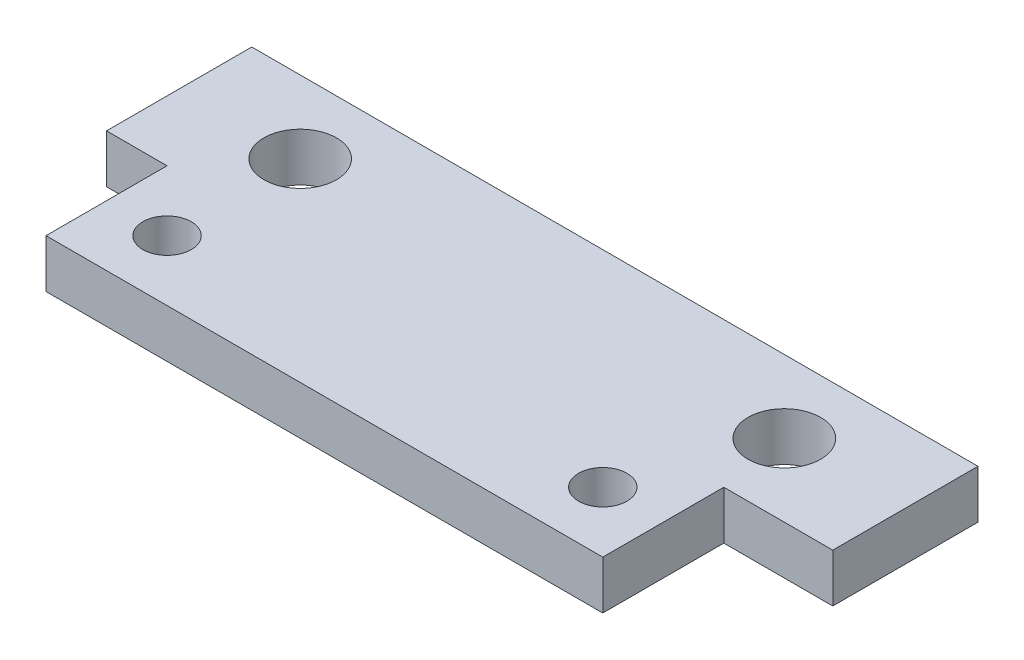
ISO-10303-21;
HEADER;
FILE_DESCRIPTION(('STEP AP214'),'2;1');
FILE_NAME('part.step','',(''),(''),'','','');
FILE_SCHEMA(('AUTOMOTIVE_DESIGN { 1 0 10303 214 1 1 1 1 }'));
ENDSEC;
DATA;
#1=APPLICATION_CONTEXT('core data for automotive mechanical design processes');
#2=APPLICATION_PROTOCOL_DEFINITION('international standard','automotive_design',2000,#1);
#3=PRODUCT_CONTEXT('',#1,'mechanical');
#4=PRODUCT('Part','Part','',(#3));
#5=PRODUCT_RELATED_PRODUCT_CATEGORY('part','',(#4));
#6=PRODUCT_DEFINITION_FORMATION('','',#4);
#7=PRODUCT_DEFINITION_CONTEXT('part definition',#1,'design');
#8=PRODUCT_DEFINITION('design','',#6,#7);
#9=PRODUCT_DEFINITION_SHAPE('','',#8);
#10=(LENGTH_UNIT() NAMED_UNIT(*) SI_UNIT(.MILLI.,.METRE.));
#11=(NAMED_UNIT(*) PLANE_ANGLE_UNIT() SI_UNIT($,.RADIAN.));
#12=(NAMED_UNIT(*) SI_UNIT($,.STERADIAN.) SOLID_ANGLE_UNIT());
#13=UNCERTAINTY_MEASURE_WITH_UNIT(LENGTH_MEASURE(1.E-05),#10,'distance_accuracy_value','');
#14=(GEOMETRIC_REPRESENTATION_CONTEXT(3) GLOBAL_UNCERTAINTY_ASSIGNED_CONTEXT((#13)) GLOBAL_UNIT_ASSIGNED_CONTEXT((#10,
#11,#12)) REPRESENTATION_CONTEXT('',''));
#15=CARTESIAN_POINT('',(0.,0.,0.));
#16=DIRECTION('',(0.,0.,1.));
#17=DIRECTION('',(1.,0.,0.));
#18=AXIS2_PLACEMENT_3D('',#15,#16,#17);
#19=CARTESIAN_POINT('',(0.,2.,0.));
#20=DIRECTION('',(0.,0.,-1.));
#21=DIRECTION('',(-1.,0.,0.));
#22=AXIS2_PLACEMENT_3D('',#19,#20,#21);
#23=PLANE('',#22);
#24=DIRECTION('',(0.,1.,0.));
#25=VECTOR('',#24,1.);
#26=CARTESIAN_POINT('',(25.5,-23.5372045918797,0.));
#27=LINE('',#26,#25);
#28=CARTESIAN_POINT('',(25.5,0.,0.));
#29=VERTEX_POINT('',#28);
#30=CARTESIAN_POINT('',(25.5,2.,0.));
#31=VERTEX_POINT('',#30);
#32=EDGE_CURVE('E122',#29,#31,#27,.T.);
#33=ORIENTED_EDGE('',*,*,#32,.F.);
#34=DIRECTION('',(1.,0.,0.));
#35=VECTOR('',#34,1.);
#36=CARTESIAN_POINT('',(0.,0.,0.));
#37=LINE('',#36,#35);
#38=CARTESIAN_POINT('',(30.,0.,0.));
#39=VERTEX_POINT('',#38);
#40=EDGE_CURVE('E167',#29,#39,#37,.T.);
#41=ORIENTED_EDGE('',*,*,#40,.T.);
#42=DIRECTION('',(0.,-1.,0.));
#43=VECTOR('',#42,1.);
#44=CARTESIAN_POINT('',(30.,2.,0.));
#45=LINE('',#44,#43);
#46=CARTESIAN_POINT('',(30.,2.,0.));
#47=VERTEX_POINT('',#46);
#48=EDGE_CURVE('E44',#47,#39,#45,.T.);
#49=ORIENTED_EDGE('',*,*,#48,.F.);
#50=DIRECTION('',(1.,0.,0.));
#51=VECTOR('',#50,1.);
#52=CARTESIAN_POINT('',(0.,2.,0.));
#53=LINE('',#52,#51);
#54=EDGE_CURVE('E159',#31,#47,#53,.T.);
#55=ORIENTED_EDGE('',*,*,#54,.F.);
#56=EDGE_LOOP('',(#33,#41,#49,#55));
#57=FACE_BOUND('',#56,.T.);
#58=ADVANCED_FACE('F36',(#57),#23,.F.);
#59=CARTESIAN_POINT('',(0.,2.,0.));
#60=DIRECTION('',(0.,-1.,0.));
#61=DIRECTION('',(0.,0.,-1.));
#62=AXIS2_PLACEMENT_3D('',#59,#60,#61);
#63=PLANE('',#62);
#64=DIRECTION('',(0.,0.,1.));
#65=VECTOR('',#64,1.);
#66=CARTESIAN_POINT('',(0.,2.,0.));
#67=LINE('',#66,#65);
#68=CARTESIAN_POINT('',(0.,2.,-6.));
#69=VERTEX_POINT('',#68);
#70=CARTESIAN_POINT('',(0.,2.,0.));
#71=VERTEX_POINT('',#70);
#72=EDGE_CURVE('E157',#69,#71,#67,.T.);
#73=ORIENTED_EDGE('',*,*,#72,.T.);
#74=CARTESIAN_POINT('',(2.5,2.,0.));
#75=VERTEX_POINT('',#74);
#76=EDGE_CURVE('E87',#71,#75,#53,.T.);
#77=ORIENTED_EDGE('',*,*,#76,.T.);
#78=DIRECTION('',(0.,0.,1.));
#79=VECTOR('',#78,1.);
#80=CARTESIAN_POINT('',(2.5,2.,0.));
#81=LINE('',#80,#79);
#82=CARTESIAN_POINT('',(2.5,2.,5.));
#83=VERTEX_POINT('',#82);
#84=EDGE_CURVE('E51',#75,#83,#81,.T.);
#85=ORIENTED_EDGE('',*,*,#84,.T.);
#86=DIRECTION('',(1.,0.,0.));
#87=VECTOR('',#86,1.);
#88=CARTESIAN_POINT('',(2.5,2.,5.));
#89=LINE('',#88,#87);
#90=CARTESIAN_POINT('',(25.5,2.,5.));
#91=VERTEX_POINT('',#90);
#92=EDGE_CURVE('E128',#83,#91,#89,.T.);
#93=ORIENTED_EDGE('',*,*,#92,.T.);
#94=DIRECTION('',(0.,0.,-1.));
#95=VECTOR('',#94,1.);
#96=CARTESIAN_POINT('',(25.5,2.,5.));
#97=LINE('',#96,#95);
#98=EDGE_CURVE('E217',#91,#31,#97,.T.);
#99=ORIENTED_EDGE('',*,*,#98,.T.);
#100=ORIENTED_EDGE('',*,*,#54,.T.);
#101=DIRECTION('',(0.,0.,-1.));
#102=VECTOR('',#101,1.);
#103=CARTESIAN_POINT('',(30.,2.,0.));
#104=LINE('',#103,#102);
#105=CARTESIAN_POINT('',(30.,2.,-6.));
#106=VERTEX_POINT('',#105);
#107=EDGE_CURVE('E161',#47,#106,#104,.T.);
#108=ORIENTED_EDGE('',*,*,#107,.T.);
#109=DIRECTION('',(-1.,0.,0.));
#110=VECTOR('',#109,1.);
#111=CARTESIAN_POINT('',(0.,2.,-6.));
#112=LINE('',#111,#110);
#113=EDGE_CURVE('E60',#106,#69,#112,.T.);
#114=ORIENTED_EDGE('',*,*,#113,.T.);
#115=EDGE_LOOP('',(#73,#77,#85,#93,#99,#100,#108,#114));
#116=FACE_BOUND('',#115,.T.);
#117=CARTESIAN_POINT('',(5.,2.,-3.));
#118=DIRECTION('',(0.,1.,0.));
#119=DIRECTION('',(0.,0.,1.));
#120=AXIS2_PLACEMENT_3D('',#117,#118,#119);
#121=CIRCLE('',#120,1.5);
#122=CARTESIAN_POINT('',(5.,2.,-1.5));
#123=VERTEX_POINT('',#122);
#124=EDGE_CURVE('E151',#123,#123,#121,.T.);
#125=ORIENTED_EDGE('',*,*,#124,.F.);
#126=EDGE_LOOP('',(#125));
#127=FACE_BOUND('',#126,.T.);
#128=CARTESIAN_POINT('',(25.,2.,-3.));
#129=DIRECTION('',(0.,1.,0.));
#130=DIRECTION('',(0.,0.,1.));
#131=AXIS2_PLACEMENT_3D('',#128,#129,#130);
#132=CIRCLE('',#131,1.5);
#133=CARTESIAN_POINT('',(25.,2.,-1.5));
#134=VERTEX_POINT('',#133);
#135=EDGE_CURVE('E143',#134,#134,#132,.T.);
#136=ORIENTED_EDGE('',*,*,#135,.F.);
#137=EDGE_LOOP('',(#136));
#138=FACE_BOUND('',#137,.T.);
#139=CARTESIAN_POINT('',(5.,2.,2.5));
#140=DIRECTION('',(0.,1.,0.));
#141=DIRECTION('',(0.,0.,1.));
#142=AXIS2_PLACEMENT_3D('',#139,#140,#141);
#143=CIRCLE('',#142,1.);
#144=CARTESIAN_POINT('',(5.,2.,3.5));
#145=VERTEX_POINT('',#144);
#146=EDGE_CURVE('E215',#145,#145,#143,.T.);
#147=ORIENTED_EDGE('',*,*,#146,.F.);
#148=EDGE_LOOP('',(#147));
#149=FACE_BOUND('',#148,.T.);
#150=CARTESIAN_POINT('',(23.,2.,2.5));
#151=DIRECTION('',(0.,1.,0.));
#152=DIRECTION('',(0.,0.,1.));
#153=AXIS2_PLACEMENT_3D('',#150,#151,#152);
#154=CIRCLE('',#153,0.999999999999998);
#155=CARTESIAN_POINT('',(23.,2.,3.5));
#156=VERTEX_POINT('',#155);
#157=EDGE_CURVE('E129',#156,#156,#154,.T.);
#158=ORIENTED_EDGE('',*,*,#157,.F.);
#159=EDGE_LOOP('',(#158));
#160=FACE_BOUND('',#159,.T.);
#161=ADVANCED_FACE('F202',(#116,#127,#138,#149,#160),#63,.F.);
#162=CARTESIAN_POINT('',(0.,0.,0.));
#163=DIRECTION('',(0.,-1.,0.));
#164=DIRECTION('',(0.,0.,-1.));
#165=AXIS2_PLACEMENT_3D('',#162,#163,#164);
#166=PLANE('',#165);
#167=CARTESIAN_POINT('',(5.,0.,-3.));
#168=DIRECTION('',(0.,1.,0.));
#169=DIRECTION('',(0.,0.,1.));
#170=AXIS2_PLACEMENT_3D('',#167,#168,#169);
#171=CIRCLE('',#170,1.5);
#172=CARTESIAN_POINT('',(5.,0.,-1.5));
#173=VERTEX_POINT('',#172);
#174=EDGE_CURVE('E146',#173,#173,#171,.T.);
#175=ORIENTED_EDGE('',*,*,#174,.T.);
#176=EDGE_LOOP('',(#175));
#177=FACE_BOUND('',#176,.T.);
#178=DIRECTION('',(0.,0.,1.));
#179=VECTOR('',#178,1.);
#180=CARTESIAN_POINT('',(0.,0.,0.));
#181=LINE('',#180,#179);
#182=CARTESIAN_POINT('',(0.,0.,-6.));
#183=VERTEX_POINT('',#182);
#184=CARTESIAN_POINT('',(0.,0.,0.));
#185=VERTEX_POINT('',#184);
#186=EDGE_CURVE('E154',#183,#185,#181,.T.);
#187=ORIENTED_EDGE('',*,*,#186,.F.);
#188=DIRECTION('',(-1.,0.,0.));
#189=VECTOR('',#188,1.);
#190=CARTESIAN_POINT('',(0.,0.,-6.));
#191=LINE('',#190,#189);
#192=CARTESIAN_POINT('',(30.,0.,-6.));
#193=VERTEX_POINT('',#192);
#194=EDGE_CURVE('E81',#193,#183,#191,.T.);
#195=ORIENTED_EDGE('',*,*,#194,.F.);
#196=DIRECTION('',(0.,0.,-1.));
#197=VECTOR('',#196,1.);
#198=CARTESIAN_POINT('',(30.,0.,0.));
#199=LINE('',#198,#197);
#200=EDGE_CURVE('E170',#39,#193,#199,.T.);
#201=ORIENTED_EDGE('',*,*,#200,.F.);
#202=ORIENTED_EDGE('',*,*,#40,.F.);
#203=DIRECTION('',(0.,0.,-1.));
#204=VECTOR('',#203,1.);
#205=CARTESIAN_POINT('',(25.5,0.,5.));
#206=LINE('',#205,#204);
#207=CARTESIAN_POINT('',(25.5,0.,5.));
#208=VERTEX_POINT('',#207);
#209=EDGE_CURVE('E118',#208,#29,#206,.T.);
#210=ORIENTED_EDGE('',*,*,#209,.F.);
#211=DIRECTION('',(1.,0.,0.));
#212=VECTOR('',#211,1.);
#213=CARTESIAN_POINT('',(2.5,0.,5.));
#214=LINE('',#213,#212);
#215=CARTESIAN_POINT('',(2.5,0.,5.));
#216=VERTEX_POINT('',#215);
#217=EDGE_CURVE('E110',#216,#208,#214,.T.);
#218=ORIENTED_EDGE('',*,*,#217,.F.);
#219=DIRECTION('',(0.,0.,1.));
#220=VECTOR('',#219,1.);
#221=CARTESIAN_POINT('',(2.5,0.,0.));
#222=LINE('',#221,#220);
#223=CARTESIAN_POINT('',(2.5,0.,0.));
#224=VERTEX_POINT('',#223);
#225=EDGE_CURVE('E116',#224,#216,#222,.T.);
#226=ORIENTED_EDGE('',*,*,#225,.F.);
#227=EDGE_CURVE('E168',#185,#224,#37,.T.);
#228=ORIENTED_EDGE('',*,*,#227,.F.);
#229=EDGE_LOOP('',(#187,#195,#201,#202,#210,#218,#226,#228));
#230=FACE_BOUND('',#229,.T.);
#231=CARTESIAN_POINT('',(25.,0.,-3.));
#232=DIRECTION('',(0.,1.,0.));
#233=DIRECTION('',(0.,0.,1.));
#234=AXIS2_PLACEMENT_3D('',#231,#232,#233);
#235=CIRCLE('',#234,1.5);
#236=CARTESIAN_POINT('',(25.,0.,-1.5));
#237=VERTEX_POINT('',#236);
#238=EDGE_CURVE('E147',#237,#237,#235,.T.);
#239=ORIENTED_EDGE('',*,*,#238,.T.);
#240=EDGE_LOOP('',(#239));
#241=FACE_BOUND('',#240,.T.);
#242=CARTESIAN_POINT('',(5.,0.,2.5));
#243=DIRECTION('',(0.,-1.,0.));
#244=DIRECTION('',(0.,0.,-1.));
#245=AXIS2_PLACEMENT_3D('',#242,#243,#244);
#246=CIRCLE('',#245,1.);
#247=CARTESIAN_POINT('',(5.,0.,1.5));
#248=VERTEX_POINT('',#247);
#249=EDGE_CURVE('E138',#248,#248,#246,.F.);
#250=ORIENTED_EDGE('',*,*,#249,.T.);
#251=EDGE_LOOP('',(#250));
#252=FACE_BOUND('',#251,.T.);
#253=CARTESIAN_POINT('',(23.,0.,2.5));
#254=DIRECTION('',(0.,-1.,0.));
#255=DIRECTION('',(0.,0.,-1.));
#256=AXIS2_PLACEMENT_3D('',#253,#254,#255);
#257=CIRCLE('',#256,0.999999999999998);
#258=CARTESIAN_POINT('',(23.,0.,1.5));
#259=VERTEX_POINT('',#258);
#260=EDGE_CURVE('E150',#259,#259,#257,.F.);
#261=ORIENTED_EDGE('',*,*,#260,.T.);
#262=EDGE_LOOP('',(#261));
#263=FACE_BOUND('',#262,.T.);
#264=ADVANCED_FACE('F113',(#177,#230,#241,#252,#263),#166,.T.);
#265=CARTESIAN_POINT('',(0.,2.,0.));
#266=DIRECTION('',(1.,0.,0.));
#267=DIRECTION('',(0.,0.,-1.));
#268=AXIS2_PLACEMENT_3D('',#265,#266,#267);
#269=PLANE('',#268);
#270=ORIENTED_EDGE('',*,*,#186,.T.);
#271=DIRECTION('',(0.,-1.,0.));
#272=VECTOR('',#271,1.);
#273=CARTESIAN_POINT('',(0.,2.,0.));
#274=LINE('',#273,#272);
#275=EDGE_CURVE('E11',#71,#185,#274,.T.);
#276=ORIENTED_EDGE('',*,*,#275,.F.);
#277=ORIENTED_EDGE('',*,*,#72,.F.);
#278=DIRECTION('',(0.,-1.,0.));
#279=VECTOR('',#278,1.);
#280=CARTESIAN_POINT('',(0.,2.,-6.));
#281=LINE('',#280,#279);
#282=EDGE_CURVE('E164',#69,#183,#281,.T.);
#283=ORIENTED_EDGE('',*,*,#282,.T.);
#284=EDGE_LOOP('',(#270,#276,#277,#283));
#285=FACE_BOUND('',#284,.T.);
#286=ADVANCED_FACE('F38',(#285),#269,.F.);
#287=ORIENTED_EDGE('',*,*,#227,.T.);
#288=DIRECTION('',(0.,1.,0.));
#289=VECTOR('',#288,1.);
#290=CARTESIAN_POINT('',(2.5,-23.5372045918797,0.));
#291=LINE('',#290,#289);
#292=EDGE_CURVE('E132',#224,#75,#291,.T.);
#293=ORIENTED_EDGE('',*,*,#292,.T.);
#294=ORIENTED_EDGE('',*,*,#76,.F.);
#295=ORIENTED_EDGE('',*,*,#275,.T.);
#296=EDGE_LOOP('',(#287,#293,#294,#295));
#297=FACE_BOUND('',#296,.T.);
#298=ADVANCED_FACE('F198',(#297),#23,.F.);
#299=CARTESIAN_POINT('',(30.,2.,0.));
#300=DIRECTION('',(-1.,0.,0.));
#301=DIRECTION('',(0.,0.,1.));
#302=AXIS2_PLACEMENT_3D('',#299,#300,#301);
#303=PLANE('',#302);
#304=ORIENTED_EDGE('',*,*,#200,.T.);
#305=DIRECTION('',(0.,-1.,0.));
#306=VECTOR('',#305,1.);
#307=CARTESIAN_POINT('',(30.,2.,-6.));
#308=LINE('',#307,#306);
#309=EDGE_CURVE('E174',#106,#193,#308,.T.);
#310=ORIENTED_EDGE('',*,*,#309,.F.);
#311=ORIENTED_EDGE('',*,*,#107,.F.);
#312=ORIENTED_EDGE('',*,*,#48,.T.);
#313=EDGE_LOOP('',(#304,#310,#311,#312));
#314=FACE_BOUND('',#313,.T.);
#315=ADVANCED_FACE('F180',(#314),#303,.F.);
#316=CARTESIAN_POINT('',(0.,2.,-6.));
#317=DIRECTION('',(0.,0.,1.));
#318=DIRECTION('',(1.,0.,0.));
#319=AXIS2_PLACEMENT_3D('',#316,#317,#318);
#320=PLANE('',#319);
#321=ORIENTED_EDGE('',*,*,#194,.T.);
#322=ORIENTED_EDGE('',*,*,#282,.F.);
#323=ORIENTED_EDGE('',*,*,#113,.F.);
#324=ORIENTED_EDGE('',*,*,#309,.T.);
#325=EDGE_LOOP('',(#321,#322,#323,#324));
#326=FACE_BOUND('',#325,.T.);
#327=ADVANCED_FACE('F187',(#326),#320,.F.);
#328=CARTESIAN_POINT('',(5.,2.,-3.));
#329=DIRECTION('',(0.,-1.,0.));
#330=DIRECTION('',(0.,0.,-1.));
#331=AXIS2_PLACEMENT_3D('',#328,#329,#330);
#332=CYLINDRICAL_SURFACE('',#331,1.5);
#333=ORIENTED_EDGE('',*,*,#124,.T.);
#334=EDGE_LOOP('',(#333));
#335=FACE_BOUND('',#334,.T.);
#336=ORIENTED_EDGE('',*,*,#174,.F.);
#337=EDGE_LOOP('',(#336));
#338=FACE_BOUND('',#337,.T.);
#339=ADVANCED_FACE('F189',(#335,#338),#332,.F.);
#340=CARTESIAN_POINT('',(25.,2.,-3.));
#341=DIRECTION('',(0.,-1.,0.));
#342=DIRECTION('',(0.,0.,-1.));
#343=AXIS2_PLACEMENT_3D('',#340,#341,#342);
#344=CYLINDRICAL_SURFACE('',#343,1.5);
#345=ORIENTED_EDGE('',*,*,#135,.T.);
#346=EDGE_LOOP('',(#345));
#347=FACE_BOUND('',#346,.T.);
#348=ORIENTED_EDGE('',*,*,#238,.F.);
#349=EDGE_LOOP('',(#348));
#350=FACE_BOUND('',#349,.T.);
#351=ADVANCED_FACE('F195',(#347,#350),#344,.F.);
#352=CARTESIAN_POINT('',(25.5,-23.5372045918797,5.));
#353=DIRECTION('',(1.,0.,0.));
#354=DIRECTION('',(0.,0.,-1.));
#355=AXIS2_PLACEMENT_3D('',#352,#353,#354);
#356=PLANE('',#355);
#357=DIRECTION('',(0.,1.,0.));
#358=VECTOR('',#357,1.);
#359=CARTESIAN_POINT('',(25.5,-23.5372045918797,5.));
#360=LINE('',#359,#358);
#361=EDGE_CURVE('E121',#208,#91,#360,.T.);
#362=ORIENTED_EDGE('',*,*,#361,.F.);
#363=ORIENTED_EDGE('',*,*,#209,.T.);
#364=ORIENTED_EDGE('',*,*,#32,.T.);
#365=ORIENTED_EDGE('',*,*,#98,.F.);
#366=EDGE_LOOP('',(#362,#363,#364,#365));
#367=FACE_BOUND('',#366,.T.);
#368=ADVANCED_FACE('F231',(#367),#356,.T.);
#369=CARTESIAN_POINT('',(2.5,-23.5372045918797,5.));
#370=DIRECTION('',(0.,0.,1.));
#371=DIRECTION('',(1.,0.,0.));
#372=AXIS2_PLACEMENT_3D('',#369,#370,#371);
#373=PLANE('',#372);
#374=DIRECTION('',(0.,1.,0.));
#375=VECTOR('',#374,1.);
#376=CARTESIAN_POINT('',(2.5,-23.5372045918797,5.));
#377=LINE('',#376,#375);
#378=EDGE_CURVE('E125',#216,#83,#377,.T.);
#379=ORIENTED_EDGE('',*,*,#378,.F.);
#380=ORIENTED_EDGE('',*,*,#217,.T.);
#381=ORIENTED_EDGE('',*,*,#361,.T.);
#382=ORIENTED_EDGE('',*,*,#92,.F.);
#383=EDGE_LOOP('',(#379,#380,#381,#382));
#384=FACE_BOUND('',#383,.T.);
#385=ADVANCED_FACE('F126',(#384),#373,.T.);
#386=CARTESIAN_POINT('',(2.5,-23.5372045918797,0.));
#387=DIRECTION('',(-1.,0.,0.));
#388=DIRECTION('',(0.,0.,1.));
#389=AXIS2_PLACEMENT_3D('',#386,#387,#388);
#390=PLANE('',#389);
#391=ORIENTED_EDGE('',*,*,#292,.F.);
#392=ORIENTED_EDGE('',*,*,#225,.T.);
#393=ORIENTED_EDGE('',*,*,#378,.T.);
#394=ORIENTED_EDGE('',*,*,#84,.F.);
#395=EDGE_LOOP('',(#391,#392,#393,#394));
#396=FACE_BOUND('',#395,.T.);
#397=ADVANCED_FACE('F131',(#396),#390,.T.);
#398=CARTESIAN_POINT('',(23.,-23.5372045918797,2.5));
#399=DIRECTION('',(0.,1.,0.));
#400=DIRECTION('',(0.,0.,1.));
#401=AXIS2_PLACEMENT_3D('',#398,#399,#400);
#402=CYLINDRICAL_SURFACE('',#401,0.999999999999998);
#403=ORIENTED_EDGE('',*,*,#157,.T.);
#404=EDGE_LOOP('',(#403));
#405=FACE_BOUND('',#404,.T.);
#406=ORIENTED_EDGE('',*,*,#260,.F.);
#407=EDGE_LOOP('',(#406));
#408=FACE_BOUND('',#407,.T.);
#409=ADVANCED_FACE('F243',(#405,#408),#402,.F.);
#410=CARTESIAN_POINT('',(5.,-23.5372045918797,2.5));
#411=DIRECTION('',(0.,1.,0.));
#412=DIRECTION('',(0.,0.,1.));
#413=AXIS2_PLACEMENT_3D('',#410,#411,#412);
#414=CYLINDRICAL_SURFACE('',#413,1.);
#415=ORIENTED_EDGE('',*,*,#146,.T.);
#416=EDGE_LOOP('',(#415));
#417=FACE_BOUND('',#416,.T.);
#418=ORIENTED_EDGE('',*,*,#249,.F.);
#419=EDGE_LOOP('',(#418));
#420=FACE_BOUND('',#419,.T.);
#421=ADVANCED_FACE('F246',(#417,#420),#414,.F.);
#422=CLOSED_SHELL('',(#58,#161,#264,#286,#298,#315,#327,#339,#351,#368,#385,#397,#409,#421));
#423=MANIFOLD_SOLID_BREP('B2',#422);
#424=ADVANCED_BREP_SHAPE_REPRESENTATION('',(#18,#423),#14);
#425=SHAPE_DEFINITION_REPRESENTATION(#9,#424);
ENDSEC;
END-ISO-10303-21;
